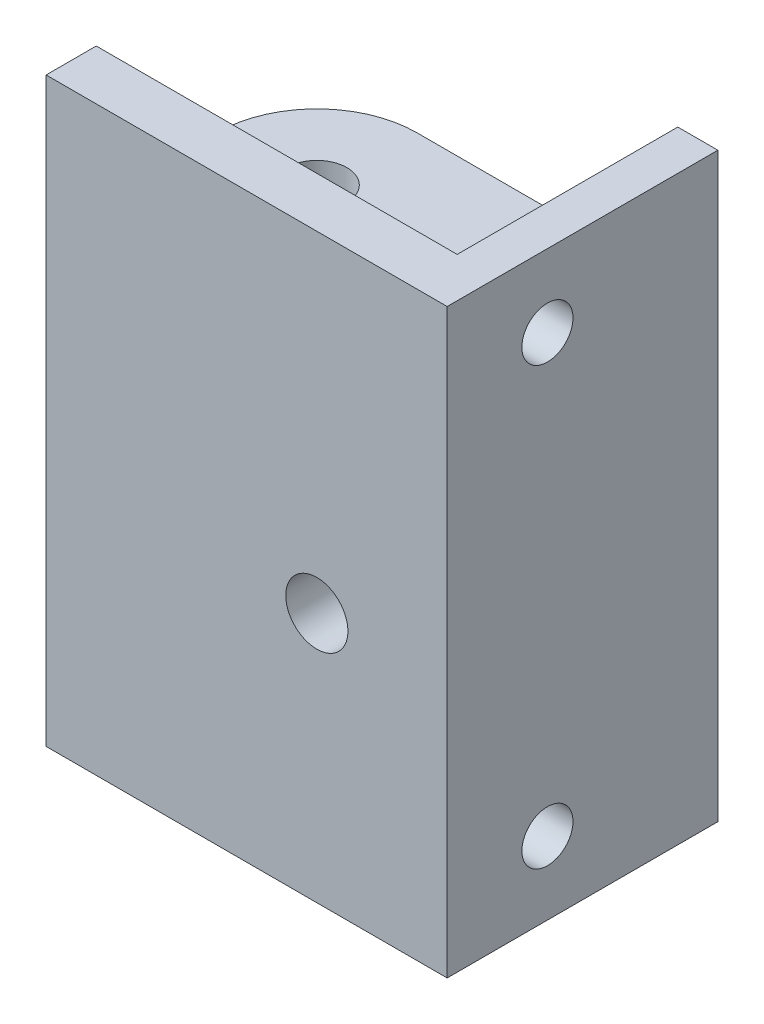
ISO-10303-21;
HEADER;
FILE_DESCRIPTION(('STEP AP214'),'2;1');
FILE_NAME('part.step','',(''),(''),'','','');
FILE_SCHEMA(('AUTOMOTIVE_DESIGN { 1 0 10303 214 1 1 1 1 }'));
ENDSEC;
DATA;
#1=APPLICATION_CONTEXT('core data for automotive mechanical design processes');
#2=APPLICATION_PROTOCOL_DEFINITION('international standard','automotive_design',2000,#1);
#3=PRODUCT_CONTEXT('',#1,'mechanical');
#4=PRODUCT('Part','Part','',(#3));
#5=PRODUCT_RELATED_PRODUCT_CATEGORY('part','',(#4));
#6=PRODUCT_DEFINITION_FORMATION('','',#4);
#7=PRODUCT_DEFINITION_CONTEXT('part definition',#1,'design');
#8=PRODUCT_DEFINITION('design','',#6,#7);
#9=PRODUCT_DEFINITION_SHAPE('','',#8);
#10=(LENGTH_UNIT() NAMED_UNIT(*) SI_UNIT(.MILLI.,.METRE.));
#11=(NAMED_UNIT(*) PLANE_ANGLE_UNIT() SI_UNIT($,.RADIAN.));
#12=(NAMED_UNIT(*) SI_UNIT($,.STERADIAN.) SOLID_ANGLE_UNIT());
#13=UNCERTAINTY_MEASURE_WITH_UNIT(LENGTH_MEASURE(1.E-05),#10,'distance_accuracy_value','');
#14=(GEOMETRIC_REPRESENTATION_CONTEXT(3) GLOBAL_UNCERTAINTY_ASSIGNED_CONTEXT((#13)) GLOBAL_UNIT_ASSIGNED_CONTEXT((#10,
#11,#12)) REPRESENTATION_CONTEXT('',''));
#15=CARTESIAN_POINT('',(0.,0.,0.));
#16=DIRECTION('',(0.,0.,1.));
#17=DIRECTION('',(1.,0.,0.));
#18=AXIS2_PLACEMENT_3D('',#15,#16,#17);
#19=CARTESIAN_POINT('',(-50.5,-55.5,-4.));
#20=DIRECTION('',(0.,1.,0.));
#21=DIRECTION('',(0.,0.,1.));
#22=AXIS2_PLACEMENT_3D('',#19,#20,#21);
#23=CYLINDRICAL_SURFACE('',#22,1.51);
#24=CARTESIAN_POINT('',(-50.5,18.5,-4.));
#25=DIRECTION('',(0.,-1.,0.));
#26=DIRECTION('',(0.,0.,-1.));
#27=AXIS2_PLACEMENT_3D('',#24,#25,#26);
#28=CIRCLE('',#27,1.51);
#29=CARTESIAN_POINT('',(-50.5,18.5,-5.51));
#30=VERTEX_POINT('',#29);
#31=EDGE_CURVE('E332',#30,#30,#28,.F.);
#32=ORIENTED_EDGE('',*,*,#31,.T.);
#33=EDGE_LOOP('',(#32));
#34=FACE_BOUND('',#33,.T.);
#35=CARTESIAN_POINT('',(-50.5,15.5,-4.));
#36=DIRECTION('',(0.,-1.,0.));
#37=DIRECTION('',(0.,0.,-1.));
#38=AXIS2_PLACEMENT_3D('',#35,#36,#37);
#39=CIRCLE('',#38,1.51);
#40=CARTESIAN_POINT('',(-50.5,15.5,-5.51));
#41=VERTEX_POINT('',#40);
#42=EDGE_CURVE('E334',#41,#41,#39,.T.);
#43=ORIENTED_EDGE('',*,*,#42,.T.);
#44=EDGE_LOOP('',(#43));
#45=FACE_BOUND('',#44,.T.);
#46=ADVANCED_FACE('F178',(#34,#45),#23,.F.);
#47=CARTESIAN_POINT('',(-50.5,39.5,-4.));
#48=DIRECTION('',(0.,-1.,0.));
#49=DIRECTION('',(0.,0.,-1.));
#50=AXIS2_PLACEMENT_3D('',#47,#48,#49);
#51=CIRCLE('',#50,1.51);
#52=CARTESIAN_POINT('',(-50.5,39.5,-5.51));
#53=VERTEX_POINT('',#52);
#54=EDGE_CURVE('E357',#53,#53,#51,.F.);
#55=ORIENTED_EDGE('',*,*,#54,.F.);
#56=EDGE_LOOP('',(#55));
#57=FACE_BOUND('',#56,.T.);
#58=CARTESIAN_POINT('',(-50.5,42.5,-4.));
#59=DIRECTION('',(0.,1.,0.));
#60=DIRECTION('',(0.,0.,1.));
#61=AXIS2_PLACEMENT_3D('',#58,#59,#60);
#62=CIRCLE('',#61,1.51);
#63=CARTESIAN_POINT('',(-50.5,42.5,-2.49));
#64=VERTEX_POINT('',#63);
#65=EDGE_CURVE('E330',#64,#64,#62,.T.);
#66=ORIENTED_EDGE('',*,*,#65,.T.);
#67=EDGE_LOOP('',(#66));
#68=FACE_BOUND('',#67,.T.);
#69=ADVANCED_FACE('F493',(#57,#68),#23,.F.);
#70=CARTESIAN_POINT('',(-40.,0.,8.5));
#71=DIRECTION('',(0.,0.,-1.));
#72=DIRECTION('',(1.,0.,0.));
#73=AXIS2_PLACEMENT_3D('',#70,#71,#72);
#74=PLANE('',#73);
#75=DIRECTION('',(0.,-1.,0.));
#76=VECTOR('',#75,1.);
#77=CARTESIAN_POINT('',(-24.,58.,8.5));
#78=LINE('',#77,#76);
#79=CARTESIAN_POINT('',(-24.,58.,8.5));
#80=VERTEX_POINT('',#79);
#81=CARTESIAN_POINT('',(-24.,44.5,8.5));
#82=VERTEX_POINT('',#81);
#83=EDGE_CURVE('E329',#80,#82,#78,.T.);
#84=ORIENTED_EDGE('',*,*,#83,.T.);
#85=DIRECTION('',(1.,0.,0.));
#86=VECTOR('',#85,1.);
#87=CARTESIAN_POINT('',(-60.,44.5,8.5));
#88=LINE('',#87,#86);
#89=CARTESIAN_POINT('',(-60.,44.5,8.5));
#90=VERTEX_POINT('',#89);
#91=EDGE_CURVE('E416',#90,#82,#88,.T.);
#92=ORIENTED_EDGE('',*,*,#91,.F.);
#93=DIRECTION('',(0.,1.,0.));
#94=VECTOR('',#93,1.);
#95=CARTESIAN_POINT('',(-60.,0.,8.5));
#96=LINE('',#95,#94);
#97=CARTESIAN_POINT('',(-60.,58.,8.5));
#98=VERTEX_POINT('',#97);
#99=EDGE_CURVE('E449',#90,#98,#96,.T.);
#100=ORIENTED_EDGE('',*,*,#99,.T.);
#101=DIRECTION('',(-1.,0.,0.));
#102=VECTOR('',#101,1.);
#103=CARTESIAN_POINT('',(-40.,58.,8.5));
#104=LINE('',#103,#102);
#105=EDGE_CURVE('E454',#80,#98,#104,.T.);
#106=ORIENTED_EDGE('',*,*,#105,.F.);
#107=EDGE_LOOP('',(#84,#92,#100,#106));
#108=FACE_BOUND('',#107,.T.);
#109=ADVANCED_FACE('F499',(#108),#74,.T.);
#110=CARTESIAN_POINT('',(-24.,58.,-13.5));
#111=DIRECTION('',(-1.,0.,0.));
#112=DIRECTION('',(0.,0.,1.));
#113=AXIS2_PLACEMENT_3D('',#110,#111,#112);
#114=PLANE('',#113);
#115=CARTESIAN_POINT('',(-24.,50.75,3.5));
#116=DIRECTION('',(-1.,0.,0.));
#117=DIRECTION('',(0.,0.,1.));
#118=AXIS2_PLACEMENT_3D('',#115,#116,#117);
#119=CIRCLE('',#118,2.55);
#120=CARTESIAN_POINT('',(-24.,50.75,6.05));
#121=VERTEX_POINT('',#120);
#122=EDGE_CURVE('E322',#121,#121,#119,.F.);
#123=ORIENTED_EDGE('',*,*,#122,.T.);
#124=EDGE_LOOP('',(#123));
#125=FACE_BOUND('',#124,.T.);
#126=DIRECTION('',(0.,-1.,0.));
#127=VECTOR('',#126,1.);
#128=CARTESIAN_POINT('',(-24.,58.,-13.5));
#129=LINE('',#128,#127);
#130=CARTESIAN_POINT('',(-24.,58.,-13.5));
#131=VERTEX_POINT('',#130);
#132=CARTESIAN_POINT('',(-24.,44.5,-13.5));
#133=VERTEX_POINT('',#132);
#134=EDGE_CURVE('E310',#131,#133,#129,.T.);
#135=ORIENTED_EDGE('',*,*,#134,.T.);
#136=DIRECTION('',(0.,0.,-1.));
#137=VECTOR('',#136,1.);
#138=CARTESIAN_POINT('',(-24.,44.5,8.5));
#139=LINE('',#138,#137);
#140=EDGE_CURVE('E413',#82,#133,#139,.T.);
#141=ORIENTED_EDGE('',*,*,#140,.F.);
#142=ORIENTED_EDGE('',*,*,#83,.F.);
#143=DIRECTION('',(0.,0.,1.));
#144=VECTOR('',#143,1.);
#145=CARTESIAN_POINT('',(-24.,58.,-13.5));
#146=LINE('',#145,#144);
#147=EDGE_CURVE('E436',#131,#80,#146,.T.);
#148=ORIENTED_EDGE('',*,*,#147,.F.);
#149=EDGE_LOOP('',(#135,#141,#142,#148));
#150=FACE_BOUND('',#149,.T.);
#151=ADVANCED_FACE('F542',(#125,#150),#114,.T.);
#152=CARTESIAN_POINT('',(-40.,0.,8.5));
#153=DIRECTION('',(0.,0.,-1.));
#154=DIRECTION('',(1.,0.,0.));
#155=AXIS2_PLACEMENT_3D('',#152,#153,#154);
#156=PLANE('',#155);
#157=DIRECTION('',(1.,0.,0.));
#158=VECTOR('',#157,1.);
#159=CARTESIAN_POINT('',(-60.,13.5,8.5));
#160=LINE('',#159,#158);
#161=CARTESIAN_POINT('',(-60.,13.5,8.5));
#162=VERTEX_POINT('',#161);
#163=CARTESIAN_POINT('',(-24.,13.5,8.5));
#164=VERTEX_POINT('',#163);
#165=EDGE_CURVE('E392',#162,#164,#160,.T.);
#166=ORIENTED_EDGE('',*,*,#165,.T.);
#167=DIRECTION('',(0.,1.,0.));
#168=VECTOR('',#167,1.);
#169=CARTESIAN_POINT('',(-24.,0.,8.5));
#170=LINE('',#169,#168);
#171=CARTESIAN_POINT('',(-24.,0.,8.5));
#172=VERTEX_POINT('',#171);
#173=EDGE_CURVE('E440',#172,#164,#170,.T.);
#174=ORIENTED_EDGE('',*,*,#173,.F.);
#175=DIRECTION('',(-1.,0.,0.));
#176=VECTOR('',#175,1.);
#177=CARTESIAN_POINT('',(-40.,0.,8.5));
#178=LINE('',#177,#176);
#179=CARTESIAN_POINT('',(-60.,0.,8.5));
#180=VERTEX_POINT('',#179);
#181=EDGE_CURVE('E450',#172,#180,#178,.T.);
#182=ORIENTED_EDGE('',*,*,#181,.T.);
#183=DIRECTION('',(0.,-1.,0.));
#184=VECTOR('',#183,1.);
#185=CARTESIAN_POINT('',(-60.,0.,8.5));
#186=LINE('',#185,#184);
#187=EDGE_CURVE('E453',#162,#180,#186,.T.);
#188=ORIENTED_EDGE('',*,*,#187,.F.);
#189=EDGE_LOOP('',(#166,#174,#182,#188));
#190=FACE_BOUND('',#189,.T.);
#191=ADVANCED_FACE('F545',(#190),#156,.T.);
#192=CARTESIAN_POINT('',(-20.,58.,-13.5));
#193=DIRECTION('',(0.,0.,-1.));
#194=DIRECTION('',(-1.,0.,0.));
#195=AXIS2_PLACEMENT_3D('',#192,#193,#194);
#196=PLANE('',#195);
#197=DIRECTION('',(0.,1.,0.));
#198=VECTOR('',#197,1.);
#199=CARTESIAN_POINT('',(-20.,0.,-13.5));
#200=LINE('',#199,#198);
#201=CARTESIAN_POINT('',(-20.,0.,-13.5));
#202=VERTEX_POINT('',#201);
#203=CARTESIAN_POINT('',(-20.,58.,-13.5));
#204=VERTEX_POINT('',#203);
#205=EDGE_CURVE('E292',#202,#204,#200,.T.);
#206=ORIENTED_EDGE('',*,*,#205,.F.);
#207=DIRECTION('',(1.,0.,0.));
#208=VECTOR('',#207,1.);
#209=CARTESIAN_POINT('',(0.,0.,-13.5));
#210=LINE('',#209,#208);
#211=CARTESIAN_POINT('',(-24.,0.,-13.5));
#212=VERTEX_POINT('',#211);
#213=EDGE_CURVE('E311',#212,#202,#210,.T.);
#214=ORIENTED_EDGE('',*,*,#213,.F.);
#215=DIRECTION('',(0.,1.,0.));
#216=VECTOR('',#215,1.);
#217=CARTESIAN_POINT('',(-24.,0.,-13.5));
#218=LINE('',#217,#216);
#219=CARTESIAN_POINT('',(-24.,13.5,-13.5));
#220=VERTEX_POINT('',#219);
#221=EDGE_CURVE('E441',#212,#220,#218,.T.);
#222=ORIENTED_EDGE('',*,*,#221,.T.);
#223=DIRECTION('',(-1.,0.,0.));
#224=VECTOR('',#223,1.);
#225=CARTESIAN_POINT('',(-24.,13.5,-13.5));
#226=LINE('',#225,#224);
#227=CARTESIAN_POINT('',(-50.,13.5,-13.5));
#228=VERTEX_POINT('',#227);
#229=EDGE_CURVE('E384',#220,#228,#226,.T.);
#230=ORIENTED_EDGE('',*,*,#229,.T.);
#231=DIRECTION('',(0.,-1.,0.));
#232=VECTOR('',#231,1.);
#233=CARTESIAN_POINT('',(-50.,18.5,-13.5));
#234=LINE('',#233,#232);
#235=CARTESIAN_POINT('',(-50.,18.5,-13.5));
#236=VERTEX_POINT('',#235);
#237=EDGE_CURVE('E408',#236,#228,#234,.T.);
#238=ORIENTED_EDGE('',*,*,#237,.F.);
#239=DIRECTION('',(-1.,0.,0.));
#240=VECTOR('',#239,1.);
#241=CARTESIAN_POINT('',(-45.,18.5,-13.5));
#242=LINE('',#241,#240);
#243=CARTESIAN_POINT('',(-40.,18.5,-13.5));
#244=VERTEX_POINT('',#243);
#245=EDGE_CURVE('E401',#244,#236,#242,.T.);
#246=ORIENTED_EDGE('',*,*,#245,.F.);
#247=DIRECTION('',(0.,-1.,0.));
#248=VECTOR('',#247,1.);
#249=CARTESIAN_POINT('',(-40.,39.5,-13.5));
#250=LINE('',#249,#248);
#251=CARTESIAN_POINT('',(-40.,39.5,-13.5));
#252=VERTEX_POINT('',#251);
#253=EDGE_CURVE('E360',#252,#244,#250,.T.);
#254=ORIENTED_EDGE('',*,*,#253,.F.);
#255=DIRECTION('',(1.,0.,0.));
#256=VECTOR('',#255,1.);
#257=CARTESIAN_POINT('',(-50.,39.5,-13.5));
#258=LINE('',#257,#256);
#259=CARTESIAN_POINT('',(-50.,39.5,-13.5));
#260=VERTEX_POINT('',#259);
#261=EDGE_CURVE('E428',#260,#252,#258,.T.);
#262=ORIENTED_EDGE('',*,*,#261,.F.);
#263=DIRECTION('',(0.,1.,0.));
#264=VECTOR('',#263,1.);
#265=CARTESIAN_POINT('',(-50.,39.5,-13.5));
#266=LINE('',#265,#264);
#267=CARTESIAN_POINT('',(-50.,44.5,-13.5));
#268=VERTEX_POINT('',#267);
#269=EDGE_CURVE('E326',#260,#268,#266,.T.);
#270=ORIENTED_EDGE('',*,*,#269,.T.);
#271=DIRECTION('',(-1.,0.,0.));
#272=VECTOR('',#271,1.);
#273=CARTESIAN_POINT('',(-24.,44.5,-13.5));
#274=LINE('',#273,#272);
#275=EDGE_CURVE('E410',#133,#268,#274,.T.);
#276=ORIENTED_EDGE('',*,*,#275,.F.);
#277=ORIENTED_EDGE('',*,*,#134,.F.);
#278=DIRECTION('',(1.,0.,0.));
#279=VECTOR('',#278,1.);
#280=CARTESIAN_POINT('',(-20.,58.,-13.5));
#281=LINE('',#280,#279);
#282=EDGE_CURVE('E303',#131,#204,#281,.T.);
#283=ORIENTED_EDGE('',*,*,#282,.T.);
#284=EDGE_LOOP('',(#206,#214,#222,#230,#238,#246,#254,#262,#270,#276,#277,#283));
#285=FACE_BOUND('',#284,.T.);
#286=CARTESIAN_POINT('',(-33.,25.,-13.5));
#287=DIRECTION('',(0.,0.,-1.));
#288=DIRECTION('',(-1.,0.,0.));
#289=AXIS2_PLACEMENT_3D('',#286,#287,#288);
#290=CIRCLE('',#289,3.1);
#291=CARTESIAN_POINT('',(-36.1,25.,-13.5));
#292=VERTEX_POINT('',#291);
#293=EDGE_CURVE('E381',#292,#292,#290,.T.);
#294=ORIENTED_EDGE('',*,*,#293,.F.);
#295=EDGE_LOOP('',(#294));
#296=FACE_BOUND('',#295,.T.);
#297=ADVANCED_FACE('F180',(#285,#296),#196,.T.);
#298=CARTESIAN_POINT('',(5.,58.,1.5));
#299=DIRECTION('',(0.,1.,0.));
#300=DIRECTION('',(0.,0.,1.));
#301=AXIS2_PLACEMENT_3D('',#298,#299,#300);
#302=PLANE('',#301);
#303=DIRECTION('',(0.,0.,-1.));
#304=VECTOR('',#303,1.);
#305=CARTESIAN_POINT('',(-20.,58.,36.5));
#306=LINE('',#305,#304);
#307=CARTESIAN_POINT('',(-20.,58.,13.5));
#308=VERTEX_POINT('',#307);
#309=EDGE_CURVE('E195',#308,#204,#306,.T.);
#310=ORIENTED_EDGE('',*,*,#309,.T.);
#311=ORIENTED_EDGE('',*,*,#282,.F.);
#312=ORIENTED_EDGE('',*,*,#147,.T.);
#313=ORIENTED_EDGE('',*,*,#105,.T.);
#314=DIRECTION('',(0.,0.,1.));
#315=VECTOR('',#314,1.);
#316=CARTESIAN_POINT('',(-60.,58.,1.5));
#317=LINE('',#316,#315);
#318=CARTESIAN_POINT('',(-60.,58.,13.5));
#319=VERTEX_POINT('',#318);
#320=EDGE_CURVE('E316',#98,#319,#317,.T.);
#321=ORIENTED_EDGE('',*,*,#320,.T.);
#322=DIRECTION('',(1.,0.,0.));
#323=VECTOR('',#322,1.);
#324=CARTESIAN_POINT('',(-20.,58.,13.5));
#325=LINE('',#324,#323);
#326=EDGE_CURVE('E12',#319,#308,#325,.T.);
#327=ORIENTED_EDGE('',*,*,#326,.T.);
#328=EDGE_LOOP('',(#310,#311,#312,#313,#321,#327));
#329=FACE_BOUND('',#328,.T.);
#330=ADVANCED_FACE('F301',(#329),#302,.T.);
#331=CARTESIAN_POINT('',(5.,0.,1.5));
#332=DIRECTION('',(0.,1.,0.));
#333=DIRECTION('',(0.,0.,1.));
#334=AXIS2_PLACEMENT_3D('',#331,#332,#333);
#335=PLANE('',#334);
#336=ORIENTED_EDGE('',*,*,#213,.T.);
#337=DIRECTION('',(0.,0.,-1.));
#338=VECTOR('',#337,1.);
#339=CARTESIAN_POINT('',(-20.,0.,36.5));
#340=LINE('',#339,#338);
#341=CARTESIAN_POINT('',(-20.,0.,13.5));
#342=VERTEX_POINT('',#341);
#343=EDGE_CURVE('E295',#342,#202,#340,.T.);
#344=ORIENTED_EDGE('',*,*,#343,.F.);
#345=DIRECTION('',(1.,0.,0.));
#346=VECTOR('',#345,1.);
#347=CARTESIAN_POINT('',(-20.,0.,13.5));
#348=LINE('',#347,#346);
#349=CARTESIAN_POINT('',(-60.,0.,13.5));
#350=VERTEX_POINT('',#349);
#351=EDGE_CURVE('E187',#350,#342,#348,.T.);
#352=ORIENTED_EDGE('',*,*,#351,.F.);
#353=DIRECTION('',(0.,0.,1.));
#354=VECTOR('',#353,1.);
#355=CARTESIAN_POINT('',(-60.,0.,1.5));
#356=LINE('',#355,#354);
#357=EDGE_CURVE('E456',#180,#350,#356,.T.);
#358=ORIENTED_EDGE('',*,*,#357,.F.);
#359=ORIENTED_EDGE('',*,*,#181,.F.);
#360=DIRECTION('',(0.,0.,1.));
#361=VECTOR('',#360,1.);
#362=CARTESIAN_POINT('',(-24.,0.,-13.5));
#363=LINE('',#362,#361);
#364=EDGE_CURVE('E444',#212,#172,#363,.T.);
#365=ORIENTED_EDGE('',*,*,#364,.F.);
#366=EDGE_LOOP('',(#336,#344,#352,#358,#359,#365));
#367=FACE_BOUND('',#366,.T.);
#368=ADVANCED_FACE('F468',(#367),#335,.F.);
#369=CARTESIAN_POINT('',(-60.,58.,1.5));
#370=DIRECTION('',(1.,0.,0.));
#371=DIRECTION('',(0.,0.,-1.));
#372=AXIS2_PLACEMENT_3D('',#369,#370,#371);
#373=PLANE('',#372);
#374=DIRECTION('',(0.,-1.,0.));
#375=VECTOR('',#374,1.);
#376=CARTESIAN_POINT('',(-60.,39.5,6.5));
#377=LINE('',#376,#375);
#378=CARTESIAN_POINT('',(-60.,39.5,6.5));
#379=VERTEX_POINT('',#378);
#380=CARTESIAN_POINT('',(-60.,18.5,6.5));
#381=VERTEX_POINT('',#380);
#382=EDGE_CURVE('E369',#379,#381,#377,.T.);
#383=ORIENTED_EDGE('',*,*,#382,.T.);
#384=DIRECTION('',(0.,0.,-1.));
#385=VECTOR('',#384,1.);
#386=CARTESIAN_POINT('',(-60.,18.5,1.5000000000001));
#387=LINE('',#386,#385);
#388=CARTESIAN_POINT('',(-60.,18.5,-3.5));
#389=VERTEX_POINT('',#388);
#390=EDGE_CURVE('E203',#381,#389,#387,.T.);
#391=ORIENTED_EDGE('',*,*,#390,.T.);
#392=DIRECTION('',(0.,-1.,0.));
#393=VECTOR('',#392,1.);
#394=CARTESIAN_POINT('',(-60.,18.5,-3.5));
#395=LINE('',#394,#393);
#396=CARTESIAN_POINT('',(-60.,13.5,-3.5));
#397=VERTEX_POINT('',#396);
#398=EDGE_CURVE('E406',#389,#397,#395,.T.);
#399=ORIENTED_EDGE('',*,*,#398,.T.);
#400=DIRECTION('',(0.,0.,1.));
#401=VECTOR('',#400,1.);
#402=CARTESIAN_POINT('',(-60.,13.5,-3.5));
#403=LINE('',#402,#401);
#404=EDGE_CURVE('E395',#397,#162,#403,.T.);
#405=ORIENTED_EDGE('',*,*,#404,.T.);
#406=ORIENTED_EDGE('',*,*,#187,.T.);
#407=ORIENTED_EDGE('',*,*,#357,.T.);
#408=DIRECTION('',(0.,-1.,0.));
#409=VECTOR('',#408,1.);
#410=CARTESIAN_POINT('',(-60.,58.,13.5));
#411=LINE('',#410,#409);
#412=EDGE_CURVE('E312',#319,#350,#411,.T.);
#413=ORIENTED_EDGE('',*,*,#412,.F.);
#414=ORIENTED_EDGE('',*,*,#320,.F.);
#415=ORIENTED_EDGE('',*,*,#99,.F.);
#416=DIRECTION('',(0.,0.,1.));
#417=VECTOR('',#416,1.);
#418=CARTESIAN_POINT('',(-60.,44.5,-3.5));
#419=LINE('',#418,#417);
#420=CARTESIAN_POINT('',(-60.,44.5,-3.5));
#421=VERTEX_POINT('',#420);
#422=EDGE_CURVE('E419',#421,#90,#419,.T.);
#423=ORIENTED_EDGE('',*,*,#422,.F.);
#424=DIRECTION('',(0.,1.,0.));
#425=VECTOR('',#424,1.);
#426=CARTESIAN_POINT('',(-60.,39.5,-3.5));
#427=LINE('',#426,#425);
#428=CARTESIAN_POINT('',(-60.,39.5,-3.5));
#429=VERTEX_POINT('',#428);
#430=EDGE_CURVE('E432',#429,#421,#427,.T.);
#431=ORIENTED_EDGE('',*,*,#430,.F.);
#432=DIRECTION('',(0.,0.,1.));
#433=VECTOR('',#432,1.);
#434=CARTESIAN_POINT('',(-60.,39.5,-3.5));
#435=LINE('',#434,#433);
#436=EDGE_CURVE('E430',#429,#379,#435,.T.);
#437=ORIENTED_EDGE('',*,*,#436,.T.);
#438=EDGE_LOOP('',(#383,#391,#399,#405,#406,#407,#413,#414,#415,#423,#431,#437));
#439=FACE_BOUND('',#438,.T.);
#440=ADVANCED_FACE('F464',(#439),#373,.F.);
#441=CARTESIAN_POINT('',(-20.,58.,13.5));
#442=DIRECTION('',(0.,0.,-1.));
#443=DIRECTION('',(-1.,0.,0.));
#444=AXIS2_PLACEMENT_3D('',#441,#442,#443);
#445=PLANE('',#444);
#446=CARTESIAN_POINT('',(-33.,25.,13.5));
#447=DIRECTION('',(0.,0.,-1.));
#448=DIRECTION('',(-1.,0.,0.));
#449=AXIS2_PLACEMENT_3D('',#446,#447,#448);
#450=CIRCLE('',#449,3.1);
#451=CARTESIAN_POINT('',(-36.1,25.,13.5));
#452=VERTEX_POINT('',#451);
#453=EDGE_CURVE('E380',#452,#452,#450,.T.);
#454=ORIENTED_EDGE('',*,*,#453,.T.);
#455=EDGE_LOOP('',(#454));
#456=FACE_BOUND('',#455,.T.);
#457=ORIENTED_EDGE('',*,*,#351,.T.);
#458=DIRECTION('',(0.,1.,0.));
#459=VECTOR('',#458,1.);
#460=CARTESIAN_POINT('',(-20.,58.,13.5));
#461=LINE('',#460,#459);
#462=EDGE_CURVE('E348',#342,#308,#461,.T.);
#463=ORIENTED_EDGE('',*,*,#462,.T.);
#464=ORIENTED_EDGE('',*,*,#326,.F.);
#465=ORIENTED_EDGE('',*,*,#412,.T.);
#466=EDGE_LOOP('',(#457,#463,#464,#465));
#467=FACE_BOUND('',#466,.T.);
#468=ADVANCED_FACE('F470',(#456,#467),#445,.F.);
#469=CARTESIAN_POINT('',(2.,50.75,3.5));
#470=DIRECTION('',(-1.,0.,0.));
#471=DIRECTION('',(0.,0.,1.));
#472=AXIS2_PLACEMENT_3D('',#469,#470,#471);
#473=CYLINDRICAL_SURFACE('',#472,2.55);
#474=CARTESIAN_POINT('',(-20.,50.75,3.5));
#475=DIRECTION('',(-1.,0.,0.));
#476=DIRECTION('',(0.,0.,1.));
#477=AXIS2_PLACEMENT_3D('',#474,#475,#476);
#478=CIRCLE('',#477,2.55);
#479=CARTESIAN_POINT('',(-20.,50.75,6.05));
#480=VERTEX_POINT('',#479);
#481=EDGE_CURVE('E471',#480,#480,#478,.F.);
#482=ORIENTED_EDGE('',*,*,#481,.T.);
#483=EDGE_LOOP('',(#482));
#484=FACE_BOUND('',#483,.T.);
#485=ORIENTED_EDGE('',*,*,#122,.F.);
#486=EDGE_LOOP('',(#485));
#487=FACE_BOUND('',#486,.T.);
#488=ADVANCED_FACE('F558',(#484,#487),#473,.F.);
#489=CARTESIAN_POINT('',(2.,7.25000000000003,3.5));
#490=DIRECTION('',(-1.,0.,0.));
#491=DIRECTION('',(0.,0.,1.));
#492=AXIS2_PLACEMENT_3D('',#489,#490,#491);
#493=CYLINDRICAL_SURFACE('',#492,2.55);
#494=CARTESIAN_POINT('',(-20.,7.25000000000003,3.5));
#495=DIRECTION('',(-1.,0.,0.));
#496=DIRECTION('',(0.,0.,1.));
#497=AXIS2_PLACEMENT_3D('',#494,#495,#496);
#498=CIRCLE('',#497,2.55);
#499=CARTESIAN_POINT('',(-20.,7.25000000000003,6.05));
#500=VERTEX_POINT('',#499);
#501=EDGE_CURVE('E182',#500,#500,#498,.F.);
#502=ORIENTED_EDGE('',*,*,#501,.T.);
#503=EDGE_LOOP('',(#502));
#504=FACE_BOUND('',#503,.T.);
#505=CARTESIAN_POINT('',(-24.,7.25000000000003,3.5));
#506=DIRECTION('',(1.,0.,0.));
#507=DIRECTION('',(0.,0.,-1.));
#508=AXIS2_PLACEMENT_3D('',#505,#506,#507);
#509=CIRCLE('',#508,2.55);
#510=CARTESIAN_POINT('',(-24.,7.25000000000003,0.95));
#511=VERTEX_POINT('',#510);
#512=EDGE_CURVE('E325',#511,#511,#509,.F.);
#513=ORIENTED_EDGE('',*,*,#512,.T.);
#514=EDGE_LOOP('',(#513));
#515=FACE_BOUND('',#514,.T.);
#516=ADVANCED_FACE('F479',(#504,#515),#493,.F.);
#517=CARTESIAN_POINT('',(-24.,0.,-13.5));
#518=DIRECTION('',(1.,0.,0.));
#519=DIRECTION('',(0.,0.,-1.));
#520=AXIS2_PLACEMENT_3D('',#517,#518,#519);
#521=PLANE('',#520);
#522=ORIENTED_EDGE('',*,*,#512,.F.);
#523=EDGE_LOOP('',(#522));
#524=FACE_BOUND('',#523,.T.);
#525=ORIENTED_EDGE('',*,*,#173,.T.);
#526=DIRECTION('',(0.,0.,-1.));
#527=VECTOR('',#526,1.);
#528=CARTESIAN_POINT('',(-24.,13.5,8.5));
#529=LINE('',#528,#527);
#530=EDGE_CURVE('E389',#164,#220,#529,.T.);
#531=ORIENTED_EDGE('',*,*,#530,.T.);
#532=ORIENTED_EDGE('',*,*,#221,.F.);
#533=ORIENTED_EDGE('',*,*,#364,.T.);
#534=EDGE_LOOP('',(#525,#531,#532,#533));
#535=FACE_BOUND('',#534,.T.);
#536=ADVANCED_FACE('F540',(#524,#535),#521,.F.);
#537=CARTESIAN_POINT('',(-50.,39.5,-3.5));
#538=DIRECTION('',(0.,1.,0.));
#539=DIRECTION('',(0.,0.,1.));
#540=AXIS2_PLACEMENT_3D('',#537,#538,#539);
#541=CYLINDRICAL_SURFACE('',#540,10.);
#542=ORIENTED_EDGE('',*,*,#430,.T.);
#543=CARTESIAN_POINT('',(-50.,44.5,-3.5));
#544=DIRECTION('',(0.,1.,0.));
#545=DIRECTION('',(0.,0.,-1.));
#546=AXIS2_PLACEMENT_3D('',#543,#544,#545);
#547=CIRCLE('',#546,10.);
#548=EDGE_CURVE('E422',#268,#421,#547,.T.);
#549=ORIENTED_EDGE('',*,*,#548,.F.);
#550=ORIENTED_EDGE('',*,*,#269,.F.);
#551=CARTESIAN_POINT('',(-50.,39.5,-3.5));
#552=DIRECTION('',(0.,1.,0.));
#553=DIRECTION('',(0.,0.,-1.));
#554=AXIS2_PLACEMENT_3D('',#551,#552,#553);
#555=CIRCLE('',#554,10.);
#556=EDGE_CURVE('E425',#260,#429,#555,.T.);
#557=ORIENTED_EDGE('',*,*,#556,.T.);
#558=EDGE_LOOP('',(#542,#549,#550,#557));
#559=FACE_BOUND('',#558,.T.);
#560=ADVANCED_FACE('F536',(#559),#541,.T.);
#561=CARTESIAN_POINT('',(-50.,39.5,-3.5));
#562=DIRECTION('',(0.,-1.,0.));
#563=DIRECTION('',(0.,0.,-1.));
#564=AXIS2_PLACEMENT_3D('',#561,#562,#563);
#565=PLANE('',#564);
#566=ORIENTED_EDGE('',*,*,#54,.T.);
#567=EDGE_LOOP('',(#566));
#568=FACE_BOUND('',#567,.T.);
#569=ORIENTED_EDGE('',*,*,#556,.F.);
#570=ORIENTED_EDGE('',*,*,#261,.T.);
#571=DIRECTION('',(0.,0.,-1.));
#572=VECTOR('',#571,1.);
#573=CARTESIAN_POINT('',(-40.,39.5,6.5));
#574=LINE('',#573,#572);
#575=CARTESIAN_POINT('',(-40.,39.5,6.5));
#576=VERTEX_POINT('',#575);
#577=EDGE_CURVE('E372',#576,#252,#574,.T.);
#578=ORIENTED_EDGE('',*,*,#577,.F.);
#579=DIRECTION('',(-1.,0.,0.));
#580=VECTOR('',#579,1.);
#581=CARTESIAN_POINT('',(-40.,39.5,6.5));
#582=LINE('',#581,#580);
#583=EDGE_CURVE('E366',#576,#379,#582,.T.);
#584=ORIENTED_EDGE('',*,*,#583,.T.);
#585=ORIENTED_EDGE('',*,*,#436,.F.);
#586=EDGE_LOOP('',(#569,#570,#578,#584,#585));
#587=FACE_BOUND('',#586,.T.);
#588=ADVANCED_FACE('F532',(#568,#587),#565,.T.);
#589=CARTESIAN_POINT('',(-50.,44.5,-3.5));
#590=DIRECTION('',(0.,-1.,0.));
#591=DIRECTION('',(0.,0.,-1.));
#592=AXIS2_PLACEMENT_3D('',#589,#590,#591);
#593=PLANE('',#592);
#594=CARTESIAN_POINT('',(-50.5,44.5,-4.));
#595=DIRECTION('',(0.,-1.,0.));
#596=DIRECTION('',(0.,0.,1.));
#597=AXIS2_PLACEMENT_3D('',#594,#595,#596);
#598=CIRCLE('',#597,3.);
#599=CARTESIAN_POINT('',(-50.5,44.5,-1.));
#600=VERTEX_POINT('',#599);
#601=EDGE_CURVE('E336',#600,#600,#598,.T.);
#602=ORIENTED_EDGE('',*,*,#601,.T.);
#603=EDGE_LOOP('',(#602));
#604=FACE_BOUND('',#603,.T.);
#605=ORIENTED_EDGE('',*,*,#275,.T.);
#606=ORIENTED_EDGE('',*,*,#548,.T.);
#607=ORIENTED_EDGE('',*,*,#422,.T.);
#608=ORIENTED_EDGE('',*,*,#91,.T.);
#609=ORIENTED_EDGE('',*,*,#140,.T.);
#610=EDGE_LOOP('',(#605,#606,#607,#608,#609));
#611=FACE_BOUND('',#610,.T.);
#612=ADVANCED_FACE('F528',(#604,#611),#593,.F.);
#613=CARTESIAN_POINT('',(-50.,18.5,-3.5));
#614=DIRECTION('',(0.,-1.,0.));
#615=DIRECTION('',(0.,0.,-1.));
#616=AXIS2_PLACEMENT_3D('',#613,#614,#615);
#617=CYLINDRICAL_SURFACE('',#616,10.);
#618=ORIENTED_EDGE('',*,*,#237,.T.);
#619=CARTESIAN_POINT('',(-50.,13.5,-3.5));
#620=DIRECTION('',(0.,1.,0.));
#621=DIRECTION('',(0.,0.,-1.));
#622=AXIS2_PLACEMENT_3D('',#619,#620,#621);
#623=CIRCLE('',#622,10.);
#624=EDGE_CURVE('E398',#228,#397,#623,.T.);
#625=ORIENTED_EDGE('',*,*,#624,.T.);
#626=ORIENTED_EDGE('',*,*,#398,.F.);
#627=CARTESIAN_POINT('',(-50.,18.5,-3.5));
#628=DIRECTION('',(0.,1.,0.));
#629=DIRECTION('',(0.,0.,-1.));
#630=AXIS2_PLACEMENT_3D('',#627,#628,#629);
#631=CIRCLE('',#630,10.);
#632=EDGE_CURVE('E403',#236,#389,#631,.T.);
#633=ORIENTED_EDGE('',*,*,#632,.F.);
#634=EDGE_LOOP('',(#618,#625,#626,#633));
#635=FACE_BOUND('',#634,.T.);
#636=ADVANCED_FACE('F524',(#635),#617,.T.);
#637=CARTESIAN_POINT('',(-45.,18.5,1.5));
#638=DIRECTION('',(0.,-1.,0.));
#639=DIRECTION('',(0.,0.,-1.));
#640=AXIS2_PLACEMENT_3D('',#637,#638,#639);
#641=PLANE('',#640);
#642=ORIENTED_EDGE('',*,*,#31,.F.);
#643=EDGE_LOOP('',(#642));
#644=FACE_BOUND('',#643,.T.);
#645=ORIENTED_EDGE('',*,*,#390,.F.);
#646=DIRECTION('',(-1.,0.,0.));
#647=VECTOR('',#646,1.);
#648=CARTESIAN_POINT('',(-40.,18.5,6.5));
#649=LINE('',#648,#647);
#650=CARTESIAN_POINT('',(-40.,18.5,6.5));
#651=VERTEX_POINT('',#650);
#652=EDGE_CURVE('E361',#651,#381,#649,.T.);
#653=ORIENTED_EDGE('',*,*,#652,.F.);
#654=DIRECTION('',(0.,0.,-1.));
#655=VECTOR('',#654,1.);
#656=CARTESIAN_POINT('',(-40.,18.5,6.5));
#657=LINE('',#656,#655);
#658=EDGE_CURVE('E377',#651,#244,#657,.T.);
#659=ORIENTED_EDGE('',*,*,#658,.T.);
#660=ORIENTED_EDGE('',*,*,#245,.T.);
#661=ORIENTED_EDGE('',*,*,#632,.T.);
#662=EDGE_LOOP('',(#645,#653,#659,#660,#661));
#663=FACE_BOUND('',#662,.T.);
#664=ADVANCED_FACE('F520',(#644,#663),#641,.F.);
#665=CARTESIAN_POINT('',(-50.,13.5,-3.5));
#666=DIRECTION('',(0.,-1.,0.));
#667=DIRECTION('',(0.,0.,-1.));
#668=AXIS2_PLACEMENT_3D('',#665,#666,#667);
#669=PLANE('',#668);
#670=CARTESIAN_POINT('',(-50.5,13.5,-4.));
#671=DIRECTION('',(0.,1.,0.));
#672=DIRECTION('',(0.,0.,-1.));
#673=AXIS2_PLACEMENT_3D('',#670,#671,#672);
#674=CIRCLE('',#673,3.);
#675=CARTESIAN_POINT('',(-50.5,13.5,-7.));
#676=VERTEX_POINT('',#675);
#677=EDGE_CURVE('E343',#676,#676,#674,.T.);
#678=ORIENTED_EDGE('',*,*,#677,.T.);
#679=EDGE_LOOP('',(#678));
#680=FACE_BOUND('',#679,.T.);
#681=ORIENTED_EDGE('',*,*,#229,.F.);
#682=ORIENTED_EDGE('',*,*,#530,.F.);
#683=ORIENTED_EDGE('',*,*,#165,.F.);
#684=ORIENTED_EDGE('',*,*,#404,.F.);
#685=ORIENTED_EDGE('',*,*,#624,.F.);
#686=EDGE_LOOP('',(#681,#682,#683,#684,#685));
#687=FACE_BOUND('',#686,.T.);
#688=ADVANCED_FACE('F516',(#680,#687),#669,.T.);
#689=CARTESIAN_POINT('',(-33.,25.,-13.5));
#690=DIRECTION('',(0.,0.,1.));
#691=DIRECTION('',(1.,0.,0.));
#692=AXIS2_PLACEMENT_3D('',#689,#690,#691);
#693=CYLINDRICAL_SURFACE('',#692,3.1);
#694=ORIENTED_EDGE('',*,*,#293,.T.);
#695=EDGE_LOOP('',(#694));
#696=FACE_BOUND('',#695,.T.);
#697=ORIENTED_EDGE('',*,*,#453,.F.);
#698=EDGE_LOOP('',(#697));
#699=FACE_BOUND('',#698,.T.);
#700=ADVANCED_FACE('F512',(#696,#699),#693,.F.);
#701=CARTESIAN_POINT('',(-40.,39.5,6.5));
#702=DIRECTION('',(1.,0.,0.));
#703=DIRECTION('',(0.,0.,-1.));
#704=AXIS2_PLACEMENT_3D('',#701,#702,#703);
#705=PLANE('',#704);
#706=ORIENTED_EDGE('',*,*,#253,.T.);
#707=ORIENTED_EDGE('',*,*,#658,.F.);
#708=DIRECTION('',(0.,-1.,0.));
#709=VECTOR('',#708,1.);
#710=CARTESIAN_POINT('',(-40.,39.5,6.5));
#711=LINE('',#710,#709);
#712=EDGE_CURVE('E363',#576,#651,#711,.T.);
#713=ORIENTED_EDGE('',*,*,#712,.F.);
#714=ORIENTED_EDGE('',*,*,#577,.T.);
#715=EDGE_LOOP('',(#706,#707,#713,#714));
#716=FACE_BOUND('',#715,.T.);
#717=ADVANCED_FACE('F508',(#716),#705,.F.);
#718=CARTESIAN_POINT('',(-40.,0.,6.5));
#719=DIRECTION('',(0.,0.,-1.));
#720=DIRECTION('',(1.,0.,0.));
#721=AXIS2_PLACEMENT_3D('',#718,#719,#720);
#722=PLANE('',#721);
#723=ORIENTED_EDGE('',*,*,#652,.T.);
#724=ORIENTED_EDGE('',*,*,#382,.F.);
#725=ORIENTED_EDGE('',*,*,#583,.F.);
#726=ORIENTED_EDGE('',*,*,#712,.T.);
#727=EDGE_LOOP('',(#723,#724,#725,#726));
#728=FACE_BOUND('',#727,.T.);
#729=ADVANCED_FACE('F505',(#728),#722,.T.);
#730=CARTESIAN_POINT('',(-50.5,42.5,-4.));
#731=DIRECTION('',(0.,1.,0.));
#732=DIRECTION('',(0.,0.,1.));
#733=AXIS2_PLACEMENT_3D('',#730,#731,#732);
#734=CYLINDRICAL_SURFACE('',#733,3.);
#735=ORIENTED_EDGE('',*,*,#601,.F.);
#736=EDGE_LOOP('',(#735));
#737=FACE_BOUND('',#736,.T.);
#738=CARTESIAN_POINT('',(-50.5,42.5,-4.));
#739=DIRECTION('',(0.,-1.,0.));
#740=DIRECTION('',(0.,0.,1.));
#741=AXIS2_PLACEMENT_3D('',#738,#739,#740);
#742=CIRCLE('',#741,3.);
#743=CARTESIAN_POINT('',(-50.5,42.5,-1.));
#744=VERTEX_POINT('',#743);
#745=EDGE_CURVE('E333',#744,#744,#742,.T.);
#746=ORIENTED_EDGE('',*,*,#745,.T.);
#747=EDGE_LOOP('',(#746));
#748=FACE_BOUND('',#747,.T.);
#749=ADVANCED_FACE('F503',(#737,#748),#734,.F.);
#750=CARTESIAN_POINT('',(-50.5,42.5,-4.));
#751=DIRECTION('',(0.,1.,0.));
#752=DIRECTION('',(0.,0.,1.));
#753=AXIS2_PLACEMENT_3D('',#750,#751,#752);
#754=PLANE('',#753);
#755=ORIENTED_EDGE('',*,*,#65,.F.);
#756=EDGE_LOOP('',(#755));
#757=FACE_BOUND('',#756,.T.);
#758=ORIENTED_EDGE('',*,*,#745,.F.);
#759=EDGE_LOOP('',(#758));
#760=FACE_BOUND('',#759,.T.);
#761=ADVANCED_FACE('F631',(#757,#760),#754,.T.);
#762=CARTESIAN_POINT('',(-50.5,15.5,-4.));
#763=DIRECTION('',(0.,-1.,0.));
#764=DIRECTION('',(0.,0.,-1.));
#765=AXIS2_PLACEMENT_3D('',#762,#763,#764);
#766=CYLINDRICAL_SURFACE('',#765,3.);
#767=ORIENTED_EDGE('',*,*,#677,.F.);
#768=EDGE_LOOP('',(#767));
#769=FACE_BOUND('',#768,.T.);
#770=CARTESIAN_POINT('',(-50.5,15.5,-4.));
#771=DIRECTION('',(0.,1.,0.));
#772=DIRECTION('',(0.,0.,-1.));
#773=AXIS2_PLACEMENT_3D('',#770,#771,#772);
#774=CIRCLE('',#773,3.);
#775=CARTESIAN_POINT('',(-50.5,15.5,-7.));
#776=VERTEX_POINT('',#775);
#777=EDGE_CURVE('E337',#776,#776,#774,.T.);
#778=ORIENTED_EDGE('',*,*,#777,.T.);
#779=EDGE_LOOP('',(#778));
#780=FACE_BOUND('',#779,.T.);
#781=ADVANCED_FACE('F489',(#769,#780),#766,.F.);
#782=CARTESIAN_POINT('',(-50.5,15.5,-4.));
#783=DIRECTION('',(0.,-1.,0.));
#784=DIRECTION('',(0.,0.,-1.));
#785=AXIS2_PLACEMENT_3D('',#782,#783,#784);
#786=PLANE('',#785);
#787=ORIENTED_EDGE('',*,*,#42,.F.);
#788=EDGE_LOOP('',(#787));
#789=FACE_BOUND('',#788,.T.);
#790=ORIENTED_EDGE('',*,*,#777,.F.);
#791=EDGE_LOOP('',(#790));
#792=FACE_BOUND('',#791,.T.);
#793=ADVANCED_FACE('F484',(#789,#792),#786,.T.);
#794=CARTESIAN_POINT('',(-20.,0.,36.5));
#795=DIRECTION('',(-1.,0.,0.));
#796=DIRECTION('',(0.,0.,1.));
#797=AXIS2_PLACEMENT_3D('',#794,#795,#796);
#798=PLANE('',#797);
#799=ORIENTED_EDGE('',*,*,#501,.F.);
#800=EDGE_LOOP('',(#799));
#801=FACE_BOUND('',#800,.T.);
#802=ORIENTED_EDGE('',*,*,#481,.F.);
#803=EDGE_LOOP('',(#802));
#804=FACE_BOUND('',#803,.T.);
#805=ORIENTED_EDGE('',*,*,#343,.T.);
#806=ORIENTED_EDGE('',*,*,#205,.T.);
#807=ORIENTED_EDGE('',*,*,#309,.F.);
#808=ORIENTED_EDGE('',*,*,#462,.F.);
#809=EDGE_LOOP('',(#805,#806,#807,#808));
#810=FACE_BOUND('',#809,.T.);
#811=ADVANCED_FACE('F293',(#801,#804,#810),#798,.F.);
#812=CLOSED_SHELL('',(#46,#69,#109,#151,#191,#297,#330,#368,#440,#468,#488,#516,#536,#560,#588,
#612,#636,#664,#688,#700,#717,#729,#749,#761,#781,#793,#811));
#813=MANIFOLD_SOLID_BREP('B2',#812);
#814=ADVANCED_BREP_SHAPE_REPRESENTATION('',(#18,#813),#14);
#815=SHAPE_DEFINITION_REPRESENTATION(#9,#814);
ENDSEC;
END-ISO-10303-21;
